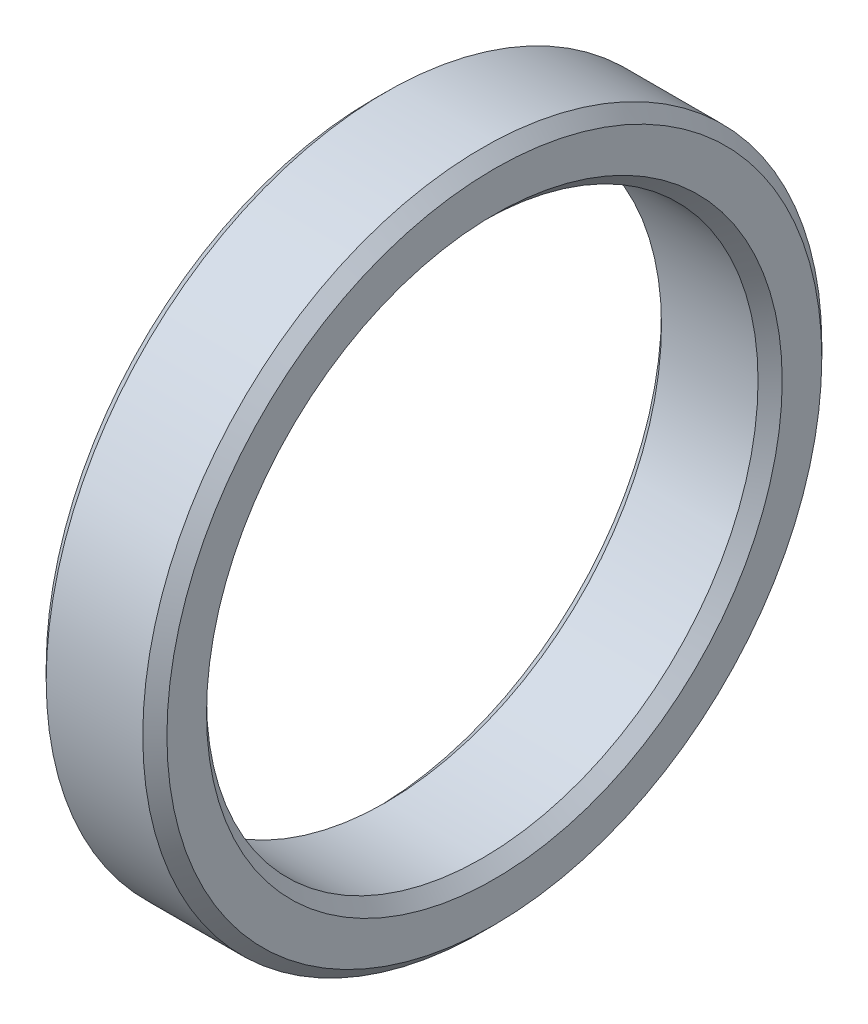
ISO-10303-21;
HEADER;
FILE_DESCRIPTION(('STEP AP214'),'2;1');
FILE_NAME('part.step','',(''),(''),'','','');
FILE_SCHEMA(('AUTOMOTIVE_DESIGN { 1 0 10303 214 1 1 1 1 }'));
ENDSEC;
DATA;
#1=APPLICATION_CONTEXT('core data for automotive mechanical design processes');
#2=APPLICATION_PROTOCOL_DEFINITION('international standard','automotive_design',2000,#1);
#3=PRODUCT_CONTEXT('',#1,'mechanical');
#4=PRODUCT('Part','Part','',(#3));
#5=PRODUCT_RELATED_PRODUCT_CATEGORY('part','',(#4));
#6=PRODUCT_DEFINITION_FORMATION('','',#4);
#7=PRODUCT_DEFINITION_CONTEXT('part definition',#1,'design');
#8=PRODUCT_DEFINITION('design','',#6,#7);
#9=PRODUCT_DEFINITION_SHAPE('','',#8);
#10=(LENGTH_UNIT() NAMED_UNIT(*) SI_UNIT(.MILLI.,.METRE.));
#11=(NAMED_UNIT(*) PLANE_ANGLE_UNIT() SI_UNIT($,.RADIAN.));
#12=(NAMED_UNIT(*) SI_UNIT($,.STERADIAN.) SOLID_ANGLE_UNIT());
#13=UNCERTAINTY_MEASURE_WITH_UNIT(LENGTH_MEASURE(1.E-05),#10,'distance_accuracy_value','');
#14=(GEOMETRIC_REPRESENTATION_CONTEXT(3) GLOBAL_UNCERTAINTY_ASSIGNED_CONTEXT((#13)) GLOBAL_UNIT_ASSIGNED_CONTEXT((#10,
#11,#12)) REPRESENTATION_CONTEXT('',''));
#15=CARTESIAN_POINT('',(0.,0.,0.));
#16=DIRECTION('',(0.,0.,1.));
#17=DIRECTION('',(1.,0.,0.));
#18=AXIS2_PLACEMENT_3D('',#15,#16,#17);
#19=CARTESIAN_POINT('',(-88.99,0.,0.));
#20=DIRECTION('',(-1.,0.,0.));
#21=DIRECTION('',(0.,0.,1.));
#22=AXIS2_PLACEMENT_3D('',#19,#20,#21);
#23=CYLINDRICAL_SURFACE('',#22,29.01315);
#24=CARTESIAN_POINT('',(1.26999999999999,0.,0.));
#25=DIRECTION('',(1.,0.,0.));
#26=DIRECTION('',(0.,0.,-1.));
#27=AXIS2_PLACEMENT_3D('',#24,#25,#26);
#28=CIRCLE('',#27,29.01315);
#29=CARTESIAN_POINT('',(1.26999999999999,0.,-29.01315));
#30=VERTEX_POINT('',#29);
#31=EDGE_CURVE('E59',#30,#30,#28,.F.);
#32=ORIENTED_EDGE('',*,*,#31,.T.);
#33=EDGE_LOOP('',(#32));
#34=FACE_BOUND('',#33,.T.);
#35=CARTESIAN_POINT('',(11.43,0.,0.));
#36=DIRECTION('',(-1.,0.,0.));
#37=DIRECTION('',(0.,0.,1.));
#38=AXIS2_PLACEMENT_3D('',#35,#36,#37);
#39=CIRCLE('',#38,29.01315);
#40=CARTESIAN_POINT('',(11.43,0.,29.01315));
#41=VERTEX_POINT('',#40);
#42=EDGE_CURVE('E62',#41,#41,#39,.F.);
#43=ORIENTED_EDGE('',*,*,#42,.T.);
#44=EDGE_LOOP('',(#43));
#45=FACE_BOUND('',#44,.T.);
#46=ADVANCED_FACE('F33',(#34,#45),#23,.F.);
#47=CARTESIAN_POINT('',(0.,29.01315,0.));
#48=DIRECTION('',(1.,0.,0.));
#49=DIRECTION('',(0.,0.,-1.));
#50=AXIS2_PLACEMENT_3D('',#47,#48,#49);
#51=PLANE('',#50);
#52=CARTESIAN_POINT('',(0.,0.,0.));
#53=DIRECTION('',(1.,0.,0.));
#54=DIRECTION('',(0.,0.,-1.));
#55=AXIS2_PLACEMENT_3D('',#52,#53,#54);
#56=CIRCLE('',#55,30.28315);
#57=CARTESIAN_POINT('',(0.,0.,-30.28315));
#58=VERTEX_POINT('',#57);
#59=EDGE_CURVE('E53',#58,#58,#56,.T.);
#60=ORIENTED_EDGE('',*,*,#59,.T.);
#61=EDGE_LOOP('',(#60));
#62=FACE_BOUND('',#61,.T.);
#63=CARTESIAN_POINT('',(0.,0.,0.));
#64=DIRECTION('',(1.,0.,0.));
#65=DIRECTION('',(0.,0.,-1.));
#66=AXIS2_PLACEMENT_3D('',#63,#64,#65);
#67=CIRCLE('',#66,34.44875);
#68=CARTESIAN_POINT('',(0.,0.,-34.44875));
#69=VERTEX_POINT('',#68);
#70=EDGE_CURVE('E56',#69,#69,#67,.F.);
#71=ORIENTED_EDGE('',*,*,#70,.T.);
#72=EDGE_LOOP('',(#71));
#73=FACE_BOUND('',#72,.T.);
#74=ADVANCED_FACE('F80',(#62,#73),#51,.F.);
#75=CARTESIAN_POINT('',(-88.99,0.,0.));
#76=DIRECTION('',(-1.,0.,0.));
#77=DIRECTION('',(0.,0.,1.));
#78=AXIS2_PLACEMENT_3D('',#75,#76,#77);
#79=CYLINDRICAL_SURFACE('',#78,35.71875);
#80=CARTESIAN_POINT('',(1.26999999999999,0.,0.));
#81=DIRECTION('',(1.,0.,0.));
#82=DIRECTION('',(0.,0.,-1.));
#83=AXIS2_PLACEMENT_3D('',#80,#81,#82);
#84=CIRCLE('',#83,35.71875);
#85=CARTESIAN_POINT('',(1.26999999999999,0.,-35.71875));
#86=VERTEX_POINT('',#85);
#87=EDGE_CURVE('E44',#86,#86,#84,.T.);
#88=ORIENTED_EDGE('',*,*,#87,.T.);
#89=EDGE_LOOP('',(#88));
#90=FACE_BOUND('',#89,.T.);
#91=CARTESIAN_POINT('',(11.43,0.,0.));
#92=DIRECTION('',(-1.,0.,0.));
#93=DIRECTION('',(0.,0.,1.));
#94=AXIS2_PLACEMENT_3D('',#91,#92,#93);
#95=CIRCLE('',#94,35.71875);
#96=CARTESIAN_POINT('',(11.43,0.,35.71875));
#97=VERTEX_POINT('',#96);
#98=EDGE_CURVE('E48',#97,#97,#95,.T.);
#99=ORIENTED_EDGE('',*,*,#98,.T.);
#100=EDGE_LOOP('',(#99));
#101=FACE_BOUND('',#100,.T.);
#102=ADVANCED_FACE('F86',(#90,#101),#79,.T.);
#103=CARTESIAN_POINT('',(12.7,35.71875,0.));
#104=DIRECTION('',(-1.,0.,0.));
#105=DIRECTION('',(0.,0.,1.));
#106=AXIS2_PLACEMENT_3D('',#103,#104,#105);
#107=PLANE('',#106);
#108=CARTESIAN_POINT('',(12.7,0.,0.));
#109=DIRECTION('',(-1.,0.,0.));
#110=DIRECTION('',(0.,0.,1.));
#111=AXIS2_PLACEMENT_3D('',#108,#109,#110);
#112=CIRCLE('',#111,30.28315);
#113=CARTESIAN_POINT('',(12.7,0.,30.28315));
#114=VERTEX_POINT('',#113);
#115=EDGE_CURVE('E10',#114,#114,#112,.T.);
#116=ORIENTED_EDGE('',*,*,#115,.T.);
#117=EDGE_LOOP('',(#116));
#118=FACE_BOUND('',#117,.T.);
#119=CARTESIAN_POINT('',(12.7,0.,0.));
#120=DIRECTION('',(-1.,0.,0.));
#121=DIRECTION('',(0.,0.,1.));
#122=AXIS2_PLACEMENT_3D('',#119,#120,#121);
#123=CIRCLE('',#122,34.44875);
#124=CARTESIAN_POINT('',(12.7,0.,34.44875));
#125=VERTEX_POINT('',#124);
#126=EDGE_CURVE('E40',#125,#125,#123,.F.);
#127=ORIENTED_EDGE('',*,*,#126,.T.);
#128=EDGE_LOOP('',(#127));
#129=FACE_BOUND('',#128,.T.);
#130=ADVANCED_FACE('F92',(#118,#129),#107,.F.);
#131=CARTESIAN_POINT('',(1.26999999999999,0.,0.));
#132=DIRECTION('',(-1.,0.,0.));
#133=DIRECTION('',(0.,0.,1.));
#134=AXIS2_PLACEMENT_3D('',#131,#132,#133);
#135=CONICAL_SURFACE('',#134,29.01315,0.785398163397444);
#136=ORIENTED_EDGE('',*,*,#59,.F.);
#137=EDGE_LOOP('',(#136));
#138=FACE_BOUND('',#137,.T.);
#139=ORIENTED_EDGE('',*,*,#31,.F.);
#140=EDGE_LOOP('',(#139));
#141=FACE_BOUND('',#140,.T.);
#142=ADVANCED_FACE('F76',(#138,#141),#135,.F.);
#143=CARTESIAN_POINT('',(0.,0.,0.));
#144=DIRECTION('',(1.,0.,0.));
#145=DIRECTION('',(0.,0.,-1.));
#146=AXIS2_PLACEMENT_3D('',#143,#144,#145);
#147=CONICAL_SURFACE('',#146,34.44875,0.78539816339744);
#148=ORIENTED_EDGE('',*,*,#87,.F.);
#149=EDGE_LOOP('',(#148));
#150=FACE_BOUND('',#149,.T.);
#151=ORIENTED_EDGE('',*,*,#70,.F.);
#152=EDGE_LOOP('',(#151));
#153=FACE_BOUND('',#152,.T.);
#154=ADVANCED_FACE('F70',(#150,#153),#147,.T.);
#155=CARTESIAN_POINT('',(12.7,0.,0.));
#156=DIRECTION('',(1.,0.,0.));
#157=DIRECTION('',(0.,0.,-1.));
#158=AXIS2_PLACEMENT_3D('',#155,#156,#157);
#159=CONICAL_SURFACE('',#158,30.28315,0.785398163397448);
#160=ORIENTED_EDGE('',*,*,#42,.F.);
#161=EDGE_LOOP('',(#160));
#162=FACE_BOUND('',#161,.T.);
#163=ORIENTED_EDGE('',*,*,#115,.F.);
#164=EDGE_LOOP('',(#163));
#165=FACE_BOUND('',#164,.T.);
#166=ADVANCED_FACE('F67',(#162,#165),#159,.F.);
#167=CARTESIAN_POINT('',(11.43,0.,0.));
#168=DIRECTION('',(-1.,0.,0.));
#169=DIRECTION('',(0.,0.,1.));
#170=AXIS2_PLACEMENT_3D('',#167,#168,#169);
#171=CONICAL_SURFACE('',#170,35.71875,0.785398163397451);
#172=ORIENTED_EDGE('',*,*,#126,.F.);
#173=EDGE_LOOP('',(#172));
#174=FACE_BOUND('',#173,.T.);
#175=ORIENTED_EDGE('',*,*,#98,.F.);
#176=EDGE_LOOP('',(#175));
#177=FACE_BOUND('',#176,.T.);
#178=ADVANCED_FACE('F35',(#174,#177),#171,.T.);
#179=CLOSED_SHELL('',(#46,#74,#102,#130,#142,#154,#166,#178));
#180=MANIFOLD_SOLID_BREP('B2',#179);
#181=ADVANCED_BREP_SHAPE_REPRESENTATION('',(#18,#180),#14);
#182=SHAPE_DEFINITION_REPRESENTATION(#9,#181);
ENDSEC;
END-ISO-10303-21;
